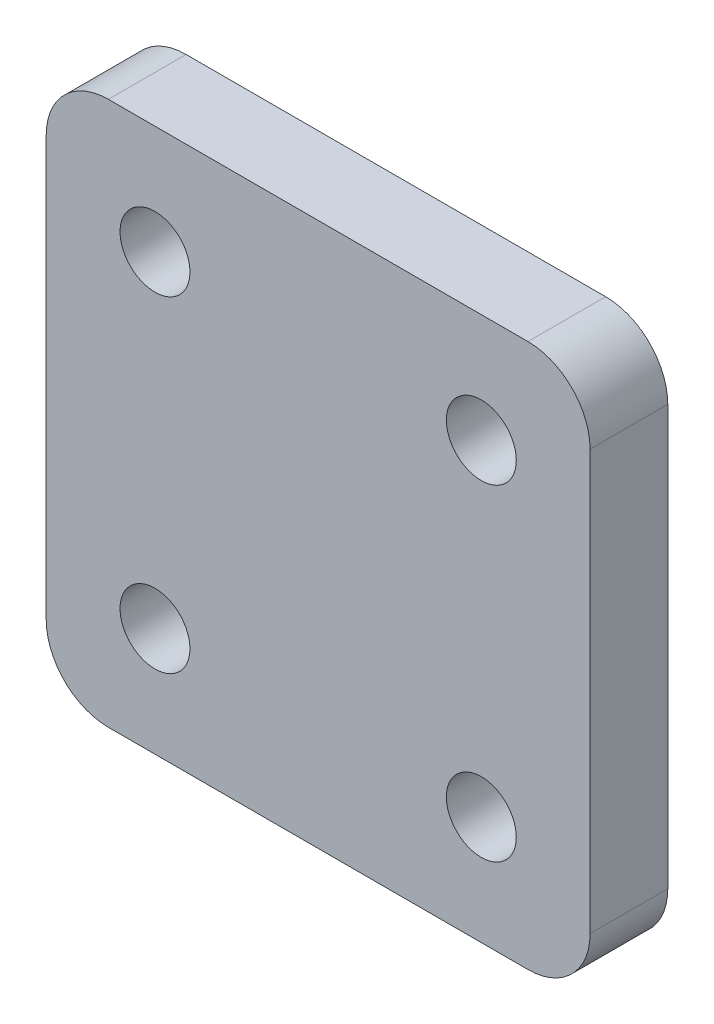
ISO-10303-21;
HEADER;
FILE_DESCRIPTION(('STEP AP214'),'2;1');
FILE_NAME('part.step','',(''),(''),'','','');
FILE_SCHEMA(('AUTOMOTIVE_DESIGN { 1 0 10303 214 1 1 1 1 }'));
ENDSEC;
DATA;
#1=APPLICATION_CONTEXT('core data for automotive mechanical design processes');
#2=APPLICATION_PROTOCOL_DEFINITION('international standard','automotive_design',2000,#1);
#3=PRODUCT_CONTEXT('',#1,'mechanical');
#4=PRODUCT('Part','Part','',(#3));
#5=PRODUCT_RELATED_PRODUCT_CATEGORY('part','',(#4));
#6=PRODUCT_DEFINITION_FORMATION('','',#4);
#7=PRODUCT_DEFINITION_CONTEXT('part definition',#1,'design');
#8=PRODUCT_DEFINITION('design','',#6,#7);
#9=PRODUCT_DEFINITION_SHAPE('','',#8);
#10=(LENGTH_UNIT() NAMED_UNIT(*) SI_UNIT(.MILLI.,.METRE.));
#11=(NAMED_UNIT(*) PLANE_ANGLE_UNIT() SI_UNIT($,.RADIAN.));
#12=(NAMED_UNIT(*) SI_UNIT($,.STERADIAN.) SOLID_ANGLE_UNIT());
#13=UNCERTAINTY_MEASURE_WITH_UNIT(LENGTH_MEASURE(1.E-05),#10,'distance_accuracy_value','');
#14=(GEOMETRIC_REPRESENTATION_CONTEXT(3) GLOBAL_UNCERTAINTY_ASSIGNED_CONTEXT((#13)) GLOBAL_UNIT_ASSIGNED_CONTEXT((#10,
#11,#12)) REPRESENTATION_CONTEXT('',''));
#15=CARTESIAN_POINT('',(0.,0.,0.));
#16=DIRECTION('',(0.,0.,1.));
#17=DIRECTION('',(1.,0.,0.));
#18=AXIS2_PLACEMENT_3D('',#15,#16,#17);
#19=CARTESIAN_POINT('',(0.,0.,5.));
#20=DIRECTION('',(0.,0.,-1.));
#21=DIRECTION('',(-1.,0.,0.));
#22=AXIS2_PLACEMENT_3D('',#19,#20,#21);
#23=PLANE('',#22);
#24=DIRECTION('',(1.,0.,0.));
#25=VECTOR('',#24,1.);
#26=CARTESIAN_POINT('',(4.29257324130461E-12,222.2,5.));
#27=LINE('',#26,#25);
#28=CARTESIAN_POINT('',(-30.9999999999957,222.2,5.));
#29=VERTEX_POINT('',#28);
#30=CARTESIAN_POINT('',(-3.99999999999571,222.2,5.));
#31=VERTEX_POINT('',#30);
#32=EDGE_CURVE('E138',#29,#31,#27,.T.);
#33=ORIENTED_EDGE('',*,*,#32,.T.);
#34=CARTESIAN_POINT('',(-3.99999999999571,226.2,5.));
#35=DIRECTION('',(0.,0.,-1.));
#36=DIRECTION('',(-1.,0.,0.));
#37=AXIS2_PLACEMENT_3D('',#34,#35,#36);
#38=CIRCLE('',#37,4.);
#39=CARTESIAN_POINT('',(4.29207760602576E-12,226.2,5.));
#40=VERTEX_POINT('',#39);
#41=EDGE_CURVE('E156',#31,#40,#38,.F.);
#42=ORIENTED_EDGE('',*,*,#41,.T.);
#43=DIRECTION('',(0.,1.,0.));
#44=VECTOR('',#43,1.);
#45=CARTESIAN_POINT('',(4.28823643261467E-12,257.2,5.));
#46=LINE('',#45,#44);
#47=CARTESIAN_POINT('',(4.28873206789352E-12,253.2,5.));
#48=VERTEX_POINT('',#47);
#49=EDGE_CURVE('E120',#40,#48,#46,.T.);
#50=ORIENTED_EDGE('',*,*,#49,.T.);
#51=CARTESIAN_POINT('',(-3.99999999999571,253.2,5.));
#52=DIRECTION('',(0.,0.,-1.));
#53=DIRECTION('',(-1.,0.,0.));
#54=AXIS2_PLACEMENT_3D('',#51,#52,#53);
#55=CIRCLE('',#54,4.);
#56=CARTESIAN_POINT('',(-3.99999999999571,257.2,5.));
#57=VERTEX_POINT('',#56);
#58=EDGE_CURVE('E152',#48,#57,#55,.F.);
#59=ORIENTED_EDGE('',*,*,#58,.T.);
#60=DIRECTION('',(-1.,0.,0.));
#61=VECTOR('',#60,1.);
#62=CARTESIAN_POINT('',(4.28823643261467E-12,257.2,5.));
#63=LINE('',#62,#61);
#64=CARTESIAN_POINT('',(-30.9999999999957,257.2,5.));
#65=VERTEX_POINT('',#64);
#66=EDGE_CURVE('E165',#57,#65,#63,.T.);
#67=ORIENTED_EDGE('',*,*,#66,.T.);
#68=CARTESIAN_POINT('',(-30.9999999999957,253.2,5.));
#69=DIRECTION('',(0.,0.,-1.));
#70=DIRECTION('',(-1.,0.,0.));
#71=AXIS2_PLACEMENT_3D('',#68,#69,#70);
#72=CIRCLE('',#71,4.);
#73=CARTESIAN_POINT('',(-34.9999999999957,253.2,5.));
#74=VERTEX_POINT('',#73);
#75=EDGE_CURVE('E55',#65,#74,#72,.F.);
#76=ORIENTED_EDGE('',*,*,#75,.T.);
#77=DIRECTION('',(0.,-1.,0.));
#78=VECTOR('',#77,1.);
#79=CARTESIAN_POINT('',(-34.9999999999957,257.2,5.));
#80=LINE('',#79,#78);
#81=CARTESIAN_POINT('',(-34.9999999999957,226.2,5.));
#82=VERTEX_POINT('',#81);
#83=EDGE_CURVE('E171',#74,#82,#80,.T.);
#84=ORIENTED_EDGE('',*,*,#83,.T.);
#85=CARTESIAN_POINT('',(-30.9999999999957,226.2,5.));
#86=DIRECTION('',(0.,0.,-1.));
#87=DIRECTION('',(-1.,0.,0.));
#88=AXIS2_PLACEMENT_3D('',#85,#86,#87);
#89=CIRCLE('',#88,4.);
#90=EDGE_CURVE('E154',#82,#29,#89,.F.);
#91=ORIENTED_EDGE('',*,*,#90,.T.);
#92=EDGE_LOOP('',(#33,#42,#50,#59,#67,#76,#84,#91));
#93=FACE_BOUND('',#92,.T.);
#94=CARTESIAN_POINT('',(-7.00000000000254,250.200000000007,5.));
#95=DIRECTION('',(0.,0.,1.));
#96=DIRECTION('',(1.,0.,0.));
#97=AXIS2_PLACEMENT_3D('',#94,#95,#96);
#98=CIRCLE('',#97,2.25000000000454);
#99=CARTESIAN_POINT('',(-4.749999999998,250.200000000007,5.));
#100=VERTEX_POINT('',#99);
#101=EDGE_CURVE('E129',#100,#100,#98,.T.);
#102=ORIENTED_EDGE('',*,*,#101,.F.);
#103=EDGE_LOOP('',(#102));
#104=FACE_BOUND('',#103,.T.);
#105=CARTESIAN_POINT('',(-7.00000000000278,229.200000000007,5.));
#106=DIRECTION('',(0.,0.,1.));
#107=DIRECTION('',(1.,0.,0.));
#108=AXIS2_PLACEMENT_3D('',#105,#106,#107);
#109=CIRCLE('',#108,2.25000000000456);
#110=CARTESIAN_POINT('',(-4.74999999999822,229.200000000007,5.));
#111=VERTEX_POINT('',#110);
#112=EDGE_CURVE('E186',#111,#111,#109,.T.);
#113=ORIENTED_EDGE('',*,*,#112,.F.);
#114=EDGE_LOOP('',(#113));
#115=FACE_BOUND('',#114,.T.);
#116=CARTESIAN_POINT('',(-27.9999999999984,229.200000000007,5.));
#117=DIRECTION('',(0.,0.,1.));
#118=DIRECTION('',(1.,0.,0.));
#119=AXIS2_PLACEMENT_3D('',#116,#117,#118);
#120=CIRCLE('',#119,2.25000000000739);
#121=CARTESIAN_POINT('',(-25.7499999999911,229.200000000007,5.));
#122=VERTEX_POINT('',#121);
#123=EDGE_CURVE('E191',#122,#122,#120,.T.);
#124=ORIENTED_EDGE('',*,*,#123,.F.);
#125=EDGE_LOOP('',(#124));
#126=FACE_BOUND('',#125,.T.);
#127=CARTESIAN_POINT('',(-27.9999999999974,250.200000000003,5.));
#128=DIRECTION('',(0.,0.,1.));
#129=DIRECTION('',(1.,0.,0.));
#130=AXIS2_PLACEMENT_3D('',#127,#128,#129);
#131=CIRCLE('',#130,2.25000000000528);
#132=CARTESIAN_POINT('',(-25.7499999999921,250.200000000003,5.));
#133=VERTEX_POINT('',#132);
#134=EDGE_CURVE('E197',#133,#133,#131,.T.);
#135=ORIENTED_EDGE('',*,*,#134,.F.);
#136=EDGE_LOOP('',(#135));
#137=FACE_BOUND('',#136,.T.);
#138=ADVANCED_FACE('F33',(#93,#104,#115,#126,#137),#23,.F.);
#139=CARTESIAN_POINT('',(0.,0.,0.));
#140=DIRECTION('',(0.,0.,-1.));
#141=DIRECTION('',(-1.,0.,0.));
#142=AXIS2_PLACEMENT_3D('',#139,#140,#141);
#143=PLANE('',#142);
#144=CARTESIAN_POINT('',(-17.4999999999978,239.700000000003,0.));
#145=DIRECTION('',(0.,0.,-1.));
#146=DIRECTION('',(-1.,0.,0.));
#147=AXIS2_PLACEMENT_3D('',#144,#145,#146);
#148=CIRCLE('',#147,9.50000000000001);
#149=CARTESIAN_POINT('',(-26.9999999999979,239.700000000003,0.));
#150=VERTEX_POINT('',#149);
#151=EDGE_CURVE('E206',#150,#150,#148,.T.);
#152=ORIENTED_EDGE('',*,*,#151,.F.);
#153=EDGE_LOOP('',(#152));
#154=FACE_BOUND('',#153,.T.);
#155=CARTESIAN_POINT('',(-27.9999999999984,229.200000000007,0.));
#156=DIRECTION('',(0.,0.,1.));
#157=DIRECTION('',(1.,0.,0.));
#158=AXIS2_PLACEMENT_3D('',#155,#156,#157);
#159=CIRCLE('',#158,2.25000000000739);
#160=CARTESIAN_POINT('',(-25.7499999999911,229.200000000007,0.));
#161=VERTEX_POINT('',#160);
#162=EDGE_CURVE('E194',#161,#161,#159,.T.);
#163=ORIENTED_EDGE('',*,*,#162,.T.);
#164=EDGE_LOOP('',(#163));
#165=FACE_BOUND('',#164,.T.);
#166=CARTESIAN_POINT('',(-7.00000000000254,250.200000000007,0.));
#167=DIRECTION('',(0.,0.,1.));
#168=DIRECTION('',(1.,0.,0.));
#169=AXIS2_PLACEMENT_3D('',#166,#167,#168);
#170=CIRCLE('',#169,2.25000000000454);
#171=CARTESIAN_POINT('',(-4.749999999998,250.200000000007,0.));
#172=VERTEX_POINT('',#171);
#173=EDGE_CURVE('E135',#172,#172,#170,.T.);
#174=ORIENTED_EDGE('',*,*,#173,.T.);
#175=EDGE_LOOP('',(#174));
#176=FACE_BOUND('',#175,.T.);
#177=DIRECTION('',(0.,1.,0.));
#178=VECTOR('',#177,1.);
#179=CARTESIAN_POINT('',(4.28823643261467E-12,257.2,0.));
#180=LINE('',#179,#178);
#181=CARTESIAN_POINT('',(4.29207760602576E-12,226.2,0.));
#182=VERTEX_POINT('',#181);
#183=CARTESIAN_POINT('',(4.28873206789352E-12,253.2,0.));
#184=VERTEX_POINT('',#183);
#185=EDGE_CURVE('E117',#182,#184,#180,.T.);
#186=ORIENTED_EDGE('',*,*,#185,.F.);
#187=CARTESIAN_POINT('',(-3.99999999999571,226.2,0.));
#188=DIRECTION('',(0.,0.,-1.));
#189=DIRECTION('',(-1.,0.,0.));
#190=AXIS2_PLACEMENT_3D('',#187,#188,#189);
#191=CIRCLE('',#190,4.);
#192=CARTESIAN_POINT('',(-3.99999999999571,222.2,0.));
#193=VERTEX_POINT('',#192);
#194=EDGE_CURVE('E100',#182,#193,#191,.T.);
#195=ORIENTED_EDGE('',*,*,#194,.T.);
#196=DIRECTION('',(1.,0.,0.));
#197=VECTOR('',#196,1.);
#198=CARTESIAN_POINT('',(4.29257324130461E-12,222.2,0.));
#199=LINE('',#198,#197);
#200=CARTESIAN_POINT('',(-30.9999999999957,222.2,0.));
#201=VERTEX_POINT('',#200);
#202=EDGE_CURVE('E142',#201,#193,#199,.T.);
#203=ORIENTED_EDGE('',*,*,#202,.F.);
#204=CARTESIAN_POINT('',(-30.9999999999957,226.2,0.));
#205=DIRECTION('',(0.,0.,-1.));
#206=DIRECTION('',(-1.,0.,0.));
#207=AXIS2_PLACEMENT_3D('',#204,#205,#206);
#208=CIRCLE('',#207,4.);
#209=CARTESIAN_POINT('',(-34.9999999999957,226.2,0.));
#210=VERTEX_POINT('',#209);
#211=EDGE_CURVE('E111',#201,#210,#208,.T.);
#212=ORIENTED_EDGE('',*,*,#211,.T.);
#213=DIRECTION('',(0.,-1.,0.));
#214=VECTOR('',#213,1.);
#215=CARTESIAN_POINT('',(-34.9999999999957,257.2,0.));
#216=LINE('',#215,#214);
#217=CARTESIAN_POINT('',(-34.9999999999957,253.2,0.));
#218=VERTEX_POINT('',#217);
#219=EDGE_CURVE('E132',#218,#210,#216,.T.);
#220=ORIENTED_EDGE('',*,*,#219,.F.);
#221=CARTESIAN_POINT('',(-30.9999999999957,253.2,0.));
#222=DIRECTION('',(0.,0.,-1.));
#223=DIRECTION('',(-1.,0.,0.));
#224=AXIS2_PLACEMENT_3D('',#221,#222,#223);
#225=CIRCLE('',#224,4.);
#226=CARTESIAN_POINT('',(-30.9999999999957,257.2,0.));
#227=VERTEX_POINT('',#226);
#228=EDGE_CURVE('E121',#218,#227,#225,.T.);
#229=ORIENTED_EDGE('',*,*,#228,.T.);
#230=DIRECTION('',(-1.,0.,0.));
#231=VECTOR('',#230,1.);
#232=CARTESIAN_POINT('',(4.28823643261467E-12,257.2,0.));
#233=LINE('',#232,#231);
#234=CARTESIAN_POINT('',(-3.99999999999571,257.2,0.));
#235=VERTEX_POINT('',#234);
#236=EDGE_CURVE('E128',#235,#227,#233,.T.);
#237=ORIENTED_EDGE('',*,*,#236,.F.);
#238=CARTESIAN_POINT('',(-3.99999999999571,253.2,0.));
#239=DIRECTION('',(0.,0.,-1.));
#240=DIRECTION('',(-1.,0.,0.));
#241=AXIS2_PLACEMENT_3D('',#238,#239,#240);
#242=CIRCLE('',#241,4.);
#243=EDGE_CURVE('E127',#235,#184,#242,.T.);
#244=ORIENTED_EDGE('',*,*,#243,.T.);
#245=EDGE_LOOP('',(#186,#195,#203,#212,#220,#229,#237,#244));
#246=FACE_BOUND('',#245,.T.);
#247=CARTESIAN_POINT('',(-7.00000000000278,229.200000000007,0.));
#248=DIRECTION('',(0.,0.,1.));
#249=DIRECTION('',(1.,0.,0.));
#250=AXIS2_PLACEMENT_3D('',#247,#248,#249);
#251=CIRCLE('',#250,2.25000000000456);
#252=CARTESIAN_POINT('',(-4.74999999999822,229.200000000007,0.));
#253=VERTEX_POINT('',#252);
#254=EDGE_CURVE('E188',#253,#253,#251,.T.);
#255=ORIENTED_EDGE('',*,*,#254,.T.);
#256=EDGE_LOOP('',(#255));
#257=FACE_BOUND('',#256,.T.);
#258=CARTESIAN_POINT('',(-27.9999999999974,250.200000000003,0.));
#259=DIRECTION('',(0.,0.,1.));
#260=DIRECTION('',(1.,0.,0.));
#261=AXIS2_PLACEMENT_3D('',#258,#259,#260);
#262=CIRCLE('',#261,2.25000000000528);
#263=CARTESIAN_POINT('',(-25.7499999999921,250.200000000003,0.));
#264=VERTEX_POINT('',#263);
#265=EDGE_CURVE('E200',#264,#264,#262,.T.);
#266=ORIENTED_EDGE('',*,*,#265,.T.);
#267=EDGE_LOOP('',(#266));
#268=FACE_BOUND('',#267,.T.);
#269=ADVANCED_FACE('F124',(#154,#165,#176,#246,#257,#268),#143,.T.);
#270=CARTESIAN_POINT('',(4.28823643261467E-12,257.2,5.));
#271=DIRECTION('',(-1.,0.,0.));
#272=DIRECTION('',(0.,-1.,0.));
#273=AXIS2_PLACEMENT_3D('',#270,#271,#272);
#274=PLANE('',#273);
#275=ORIENTED_EDGE('',*,*,#49,.F.);
#276=DIRECTION('',(0.,0.,-1.));
#277=VECTOR('',#276,1.);
#278=CARTESIAN_POINT('',(4.29207760602576E-12,226.2,5.));
#279=LINE('',#278,#277);
#280=EDGE_CURVE('E104',#40,#182,#279,.T.);
#281=ORIENTED_EDGE('',*,*,#280,.T.);
#282=ORIENTED_EDGE('',*,*,#185,.T.);
#283=DIRECTION('',(0.,0.,-1.));
#284=VECTOR('',#283,1.);
#285=CARTESIAN_POINT('',(4.28873206789352E-12,253.2,5.));
#286=LINE('',#285,#284);
#287=EDGE_CURVE('E122',#184,#48,#286,.F.);
#288=ORIENTED_EDGE('',*,*,#287,.T.);
#289=EDGE_LOOP('',(#275,#281,#282,#288));
#290=FACE_BOUND('',#289,.T.);
#291=ADVANCED_FACE('F116',(#290),#274,.F.);
#292=CARTESIAN_POINT('',(4.28823643261467E-12,257.2,5.));
#293=DIRECTION('',(0.,-1.,0.));
#294=DIRECTION('',(0.,0.,-1.));
#295=AXIS2_PLACEMENT_3D('',#292,#293,#294);
#296=PLANE('',#295);
#297=ORIENTED_EDGE('',*,*,#66,.F.);
#298=DIRECTION('',(0.,0.,-1.));
#299=VECTOR('',#298,1.);
#300=CARTESIAN_POINT('',(-3.99999999999571,257.2,5.));
#301=LINE('',#300,#299);
#302=EDGE_CURVE('E11',#57,#235,#301,.T.);
#303=ORIENTED_EDGE('',*,*,#302,.T.);
#304=ORIENTED_EDGE('',*,*,#236,.T.);
#305=DIRECTION('',(0.,0.,-1.));
#306=VECTOR('',#305,1.);
#307=CARTESIAN_POINT('',(-30.9999999999957,257.2,5.));
#308=LINE('',#307,#306);
#309=EDGE_CURVE('E41',#227,#65,#308,.F.);
#310=ORIENTED_EDGE('',*,*,#309,.T.);
#311=EDGE_LOOP('',(#297,#303,#304,#310));
#312=FACE_BOUND('',#311,.T.);
#313=ADVANCED_FACE('F164',(#312),#296,.F.);
#314=CARTESIAN_POINT('',(-34.9999999999957,257.2,5.));
#315=DIRECTION('',(1.,0.,0.));
#316=DIRECTION('',(0.,1.,0.));
#317=AXIS2_PLACEMENT_3D('',#314,#315,#316);
#318=PLANE('',#317);
#319=ORIENTED_EDGE('',*,*,#219,.T.);
#320=DIRECTION('',(0.,0.,-1.));
#321=VECTOR('',#320,1.);
#322=CARTESIAN_POINT('',(-34.9999999999957,226.2,5.));
#323=LINE('',#322,#321);
#324=EDGE_CURVE('E48',#210,#82,#323,.F.);
#325=ORIENTED_EDGE('',*,*,#324,.T.);
#326=ORIENTED_EDGE('',*,*,#83,.F.);
#327=DIRECTION('',(0.,0.,-1.));
#328=VECTOR('',#327,1.);
#329=CARTESIAN_POINT('',(-34.9999999999957,253.2,5.));
#330=LINE('',#329,#328);
#331=EDGE_CURVE('E158',#74,#218,#330,.T.);
#332=ORIENTED_EDGE('',*,*,#331,.T.);
#333=EDGE_LOOP('',(#319,#325,#326,#332));
#334=FACE_BOUND('',#333,.T.);
#335=ADVANCED_FACE('F175',(#334),#318,.F.);
#336=CARTESIAN_POINT('',(4.29257324130461E-12,222.2,5.));
#337=DIRECTION('',(0.,1.,0.));
#338=DIRECTION('',(0.,0.,1.));
#339=AXIS2_PLACEMENT_3D('',#336,#337,#338);
#340=PLANE('',#339);
#341=ORIENTED_EDGE('',*,*,#202,.T.);
#342=DIRECTION('',(0.,0.,-1.));
#343=VECTOR('',#342,1.);
#344=CARTESIAN_POINT('',(-3.99999999999571,222.2,5.));
#345=LINE('',#344,#343);
#346=EDGE_CURVE('E105',#193,#31,#345,.F.);
#347=ORIENTED_EDGE('',*,*,#346,.T.);
#348=ORIENTED_EDGE('',*,*,#32,.F.);
#349=DIRECTION('',(0.,0.,-1.));
#350=VECTOR('',#349,1.);
#351=CARTESIAN_POINT('',(-30.9999999999957,222.2,5.));
#352=LINE('',#351,#350);
#353=EDGE_CURVE('E110',#29,#201,#352,.T.);
#354=ORIENTED_EDGE('',*,*,#353,.T.);
#355=EDGE_LOOP('',(#341,#347,#348,#354));
#356=FACE_BOUND('',#355,.T.);
#357=ADVANCED_FACE('F182',(#356),#340,.F.);
#358=CARTESIAN_POINT('',(-7.00000000000254,250.200000000007,5.));
#359=DIRECTION('',(0.,0.,-1.));
#360=DIRECTION('',(-1.,0.,0.));
#361=AXIS2_PLACEMENT_3D('',#358,#359,#360);
#362=CYLINDRICAL_SURFACE('',#361,2.25000000000454);
#363=ORIENTED_EDGE('',*,*,#101,.T.);
#364=EDGE_LOOP('',(#363));
#365=FACE_BOUND('',#364,.T.);
#366=ORIENTED_EDGE('',*,*,#173,.F.);
#367=EDGE_LOOP('',(#366));
#368=FACE_BOUND('',#367,.T.);
#369=ADVANCED_FACE('F227',(#365,#368),#362,.F.);
#370=CARTESIAN_POINT('',(-7.00000000000278,229.200000000007,5.));
#371=DIRECTION('',(0.,0.,-1.));
#372=DIRECTION('',(-1.,0.,0.));
#373=AXIS2_PLACEMENT_3D('',#370,#371,#372);
#374=CYLINDRICAL_SURFACE('',#373,2.25000000000456);
#375=ORIENTED_EDGE('',*,*,#112,.T.);
#376=EDGE_LOOP('',(#375));
#377=FACE_BOUND('',#376,.T.);
#378=ORIENTED_EDGE('',*,*,#254,.F.);
#379=EDGE_LOOP('',(#378));
#380=FACE_BOUND('',#379,.T.);
#381=ADVANCED_FACE('F229',(#377,#380),#374,.F.);
#382=CARTESIAN_POINT('',(-27.9999999999984,229.200000000007,5.));
#383=DIRECTION('',(0.,0.,-1.));
#384=DIRECTION('',(-1.,0.,0.));
#385=AXIS2_PLACEMENT_3D('',#382,#383,#384);
#386=CYLINDRICAL_SURFACE('',#385,2.25000000000739);
#387=ORIENTED_EDGE('',*,*,#123,.T.);
#388=EDGE_LOOP('',(#387));
#389=FACE_BOUND('',#388,.T.);
#390=ORIENTED_EDGE('',*,*,#162,.F.);
#391=EDGE_LOOP('',(#390));
#392=FACE_BOUND('',#391,.T.);
#393=ADVANCED_FACE('F236',(#389,#392),#386,.F.);
#394=CARTESIAN_POINT('',(-27.9999999999974,250.200000000003,5.));
#395=DIRECTION('',(0.,0.,-1.));
#396=DIRECTION('',(-1.,0.,0.));
#397=AXIS2_PLACEMENT_3D('',#394,#395,#396);
#398=CYLINDRICAL_SURFACE('',#397,2.25000000000528);
#399=ORIENTED_EDGE('',*,*,#134,.T.);
#400=EDGE_LOOP('',(#399));
#401=FACE_BOUND('',#400,.T.);
#402=ORIENTED_EDGE('',*,*,#265,.F.);
#403=EDGE_LOOP('',(#402));
#404=FACE_BOUND('',#403,.T.);
#405=ADVANCED_FACE('F253',(#401,#404),#398,.F.);
#406=CARTESIAN_POINT('',(-3.99999999999571,226.2,5.));
#407=DIRECTION('',(0.,0.,-1.));
#408=DIRECTION('',(-1.,0.,0.));
#409=AXIS2_PLACEMENT_3D('',#406,#407,#408);
#410=CYLINDRICAL_SURFACE('',#409,4.);
#411=ORIENTED_EDGE('',*,*,#41,.F.);
#412=ORIENTED_EDGE('',*,*,#346,.F.);
#413=ORIENTED_EDGE('',*,*,#194,.F.);
#414=ORIENTED_EDGE('',*,*,#280,.F.);
#415=EDGE_LOOP('',(#411,#412,#413,#414));
#416=FACE_BOUND('',#415,.T.);
#417=ADVANCED_FACE('F103',(#416),#410,.T.);
#418=CARTESIAN_POINT('',(-30.9999999999957,226.2,5.));
#419=DIRECTION('',(0.,0.,-1.));
#420=DIRECTION('',(-1.,0.,0.));
#421=AXIS2_PLACEMENT_3D('',#418,#419,#420);
#422=CYLINDRICAL_SURFACE('',#421,4.);
#423=ORIENTED_EDGE('',*,*,#90,.F.);
#424=ORIENTED_EDGE('',*,*,#324,.F.);
#425=ORIENTED_EDGE('',*,*,#211,.F.);
#426=ORIENTED_EDGE('',*,*,#353,.F.);
#427=EDGE_LOOP('',(#423,#424,#425,#426));
#428=FACE_BOUND('',#427,.T.);
#429=ADVANCED_FACE('F179',(#428),#422,.T.);
#430=CARTESIAN_POINT('',(-3.99999999999571,253.2,5.));
#431=DIRECTION('',(0.,0.,-1.));
#432=DIRECTION('',(-1.,0.,0.));
#433=AXIS2_PLACEMENT_3D('',#430,#431,#432);
#434=CYLINDRICAL_SURFACE('',#433,4.);
#435=ORIENTED_EDGE('',*,*,#58,.F.);
#436=ORIENTED_EDGE('',*,*,#287,.F.);
#437=ORIENTED_EDGE('',*,*,#243,.F.);
#438=ORIENTED_EDGE('',*,*,#302,.F.);
#439=EDGE_LOOP('',(#435,#436,#437,#438));
#440=FACE_BOUND('',#439,.T.);
#441=ADVANCED_FACE('F255',(#440),#434,.T.);
#442=CARTESIAN_POINT('',(-30.9999999999957,253.2,5.));
#443=DIRECTION('',(0.,0.,-1.));
#444=DIRECTION('',(-1.,0.,0.));
#445=AXIS2_PLACEMENT_3D('',#442,#443,#444);
#446=CYLINDRICAL_SURFACE('',#445,4.);
#447=ORIENTED_EDGE('',*,*,#75,.F.);
#448=ORIENTED_EDGE('',*,*,#309,.F.);
#449=ORIENTED_EDGE('',*,*,#228,.F.);
#450=ORIENTED_EDGE('',*,*,#331,.F.);
#451=EDGE_LOOP('',(#447,#448,#449,#450));
#452=FACE_BOUND('',#451,.T.);
#453=ADVANCED_FACE('F35',(#452),#446,.T.);
#454=CARTESIAN_POINT('',(-17.4999999999978,239.700000000003,3.));
#455=DIRECTION('',(0.,0.,-1.));
#456=DIRECTION('',(-1.,0.,0.));
#457=AXIS2_PLACEMENT_3D('',#454,#455,#456);
#458=CYLINDRICAL_SURFACE('',#457,9.50000000000001);
#459=CARTESIAN_POINT('',(-17.4999999999978,239.700000000003,3.));
#460=DIRECTION('',(0.,0.,-1.));
#461=DIRECTION('',(-1.,0.,0.));
#462=AXIS2_PLACEMENT_3D('',#459,#460,#461);
#463=CIRCLE('',#462,9.50000000000001);
#464=CARTESIAN_POINT('',(-26.9999999999979,239.700000000003,3.));
#465=VERTEX_POINT('',#464);
#466=EDGE_CURVE('E203',#465,#465,#463,.T.);
#467=ORIENTED_EDGE('',*,*,#466,.F.);
#468=EDGE_LOOP('',(#467));
#469=FACE_BOUND('',#468,.T.);
#470=ORIENTED_EDGE('',*,*,#151,.T.);
#471=EDGE_LOOP('',(#470));
#472=FACE_BOUND('',#471,.T.);
#473=ADVANCED_FACE('F214',(#469,#472),#458,.F.);
#474=CARTESIAN_POINT('',(-17.4999999999978,239.700000000003,3.));
#475=DIRECTION('',(0.,0.,-1.));
#476=DIRECTION('',(-1.,0.,0.));
#477=AXIS2_PLACEMENT_3D('',#474,#475,#476);
#478=PLANE('',#477);
#479=ORIENTED_EDGE('',*,*,#466,.T.);
#480=EDGE_LOOP('',(#479));
#481=FACE_BOUND('',#480,.T.);
#482=ADVANCED_FACE('F212',(#481),#478,.T.);
#483=CLOSED_SHELL('',(#138,#269,#291,#313,#335,#357,#369,#381,#393,#405,#417,#429,#441,#453,
#473,#482));
#484=MANIFOLD_SOLID_BREP('B2',#483);
#485=ADVANCED_BREP_SHAPE_REPRESENTATION('',(#18,#484),#14);
#486=SHAPE_DEFINITION_REPRESENTATION(#9,#485);
ENDSEC;
END-ISO-10303-21;
